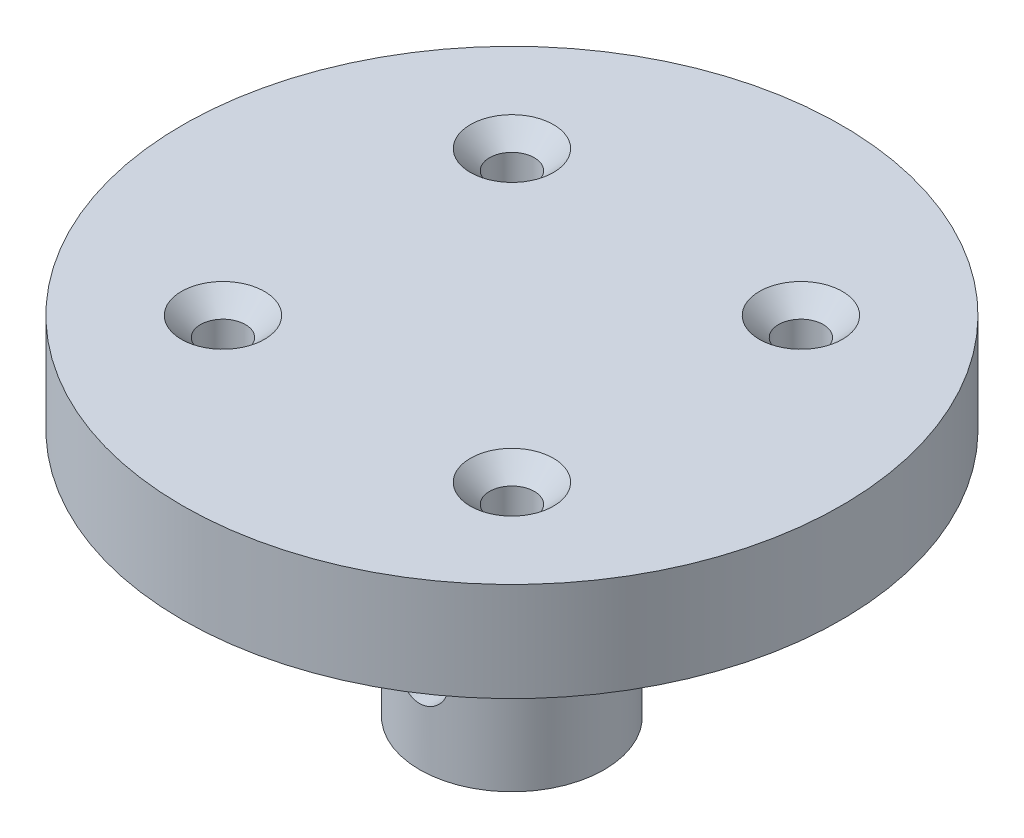
ISO-10303-21;
HEADER;
FILE_DESCRIPTION(('STEP AP214'),'2;1');
FILE_NAME('part.step','',(''),(''),'','','');
FILE_SCHEMA(('AUTOMOTIVE_DESIGN { 1 0 10303 214 1 1 1 1 }'));
ENDSEC;
DATA;
#1=APPLICATION_CONTEXT('core data for automotive mechanical design processes');
#2=APPLICATION_PROTOCOL_DEFINITION('international standard','automotive_design',2000,#1);
#3=PRODUCT_CONTEXT('',#1,'mechanical');
#4=PRODUCT('Part','Part','',(#3));
#5=PRODUCT_RELATED_PRODUCT_CATEGORY('part','',(#4));
#6=PRODUCT_DEFINITION_FORMATION('','',#4);
#7=PRODUCT_DEFINITION_CONTEXT('part definition',#1,'design');
#8=PRODUCT_DEFINITION('design','',#6,#7);
#9=PRODUCT_DEFINITION_SHAPE('','',#8);
#10=(LENGTH_UNIT() NAMED_UNIT(*) SI_UNIT(.MILLI.,.METRE.));
#11=(NAMED_UNIT(*) PLANE_ANGLE_UNIT() SI_UNIT($,.RADIAN.));
#12=(NAMED_UNIT(*) SI_UNIT($,.STERADIAN.) SOLID_ANGLE_UNIT());
#13=UNCERTAINTY_MEASURE_WITH_UNIT(LENGTH_MEASURE(1.E-05),#10,'distance_accuracy_value','');
#14=(GEOMETRIC_REPRESENTATION_CONTEXT(3) GLOBAL_UNCERTAINTY_ASSIGNED_CONTEXT((#13)) GLOBAL_UNIT_ASSIGNED_CONTEXT((#10,
#11,#12)) REPRESENTATION_CONTEXT('',''));
#15=CARTESIAN_POINT('',(0.,0.,0.));
#16=DIRECTION('',(0.,0.,1.));
#17=DIRECTION('',(1.,0.,0.));
#18=AXIS2_PLACEMENT_3D('',#15,#16,#17);
#19=CARTESIAN_POINT('',(0.,-12.6,10.5));
#20=DIRECTION('',(0.,0.,-1.));
#21=DIRECTION('',(-1.,0.,0.));
#22=AXIS2_PLACEMENT_3D('',#19,#20,#21);
#23=CYLINDRICAL_SURFACE('',#22,1.);
#24=CARTESIAN_POINT('',(0.,-12.6,3.));
#25=DIRECTION('',(0.,0.,-1.));
#26=DIRECTION('',(-1.,0.,0.));
#27=AXIS2_PLACEMENT_3D('',#24,#25,#26);
#28=CIRCLE('',#27,1.);
#29=CARTESIAN_POINT('',(-1.,-12.6,3.));
#30=VERTEX_POINT('',#29);
#31=EDGE_CURVE('E97',#30,#30,#28,.F.);
#32=ORIENTED_EDGE('',*,*,#31,.F.);
#33=EDGE_LOOP('',(#32));
#34=FACE_BOUND('',#33,.T.);
#35=CARTESIAN_POINT('',(0.,-12.6,5.));
#36=DIRECTION('',(0.,0.,1.));
#37=DIRECTION('',(1.,0.,0.));
#38=AXIS2_PLACEMENT_3D('',#35,#36,#37);
#39=CIRCLE('',#38,1.);
#40=CARTESIAN_POINT('',(1.,-12.6,5.));
#41=VERTEX_POINT('',#40);
#42=EDGE_CURVE('E100',#41,#41,#39,.T.);
#43=ORIENTED_EDGE('',*,*,#42,.T.);
#44=EDGE_LOOP('',(#43));
#45=FACE_BOUND('',#44,.T.);
#46=ADVANCED_FACE('F52',(#34,#45),#23,.F.);
#47=CARTESIAN_POINT('',(0.,-18.85,0.));
#48=DIRECTION('',(0.,1.,0.));
#49=DIRECTION('',(0.,0.,1.));
#50=AXIS2_PLACEMENT_3D('',#47,#48,#49);
#51=CYLINDRICAL_SURFACE('',#50,7.);
#52=CARTESIAN_POINT('',(0.,-18.85,0.));
#53=DIRECTION('',(0.,-1.,0.));
#54=DIRECTION('',(0.,0.,-1.));
#55=AXIS2_PLACEMENT_3D('',#52,#53,#54);
#56=CIRCLE('',#55,7.);
#57=CARTESIAN_POINT('',(0.,-18.85,-7.));
#58=VERTEX_POINT('',#57);
#59=EDGE_CURVE('E89',#58,#58,#56,.T.);
#60=ORIENTED_EDGE('',*,*,#59,.F.);
#61=EDGE_LOOP('',(#60));
#62=FACE_BOUND('',#61,.T.);
#63=CARTESIAN_POINT('',(0.,0.,0.));
#64=DIRECTION('',(0.,1.,0.));
#65=DIRECTION('',(0.,0.,1.));
#66=AXIS2_PLACEMENT_3D('',#63,#64,#65);
#67=CIRCLE('',#66,7.);
#68=CARTESIAN_POINT('',(0.,0.,7.));
#69=VERTEX_POINT('',#68);
#70=EDGE_CURVE('E65',#69,#69,#67,.F.);
#71=ORIENTED_EDGE('',*,*,#70,.T.);
#72=EDGE_LOOP('',(#71));
#73=FACE_BOUND('',#72,.T.);
#74=CARTESIAN_POINT('',(0.,-14.5,7.));
#75=CARTESIAN_POINT('',(-0.10467230840533,-14.4999976621881,6.99999849339145));
#76=CARTESIAN_POINT('',(-0.209369392593464,-14.4913213337643,6.99762920626555));
#77=CARTESIAN_POINT('',(-0.41574301210352,-14.4569095142351,6.98840792003667));
#78=CARTESIAN_POINT('',(-0.517418147915488,-14.4311662439345,6.98155387677855));
#79=CARTESIAN_POINT('',(-0.714739469024512,-14.3635225636996,6.96411884296715));
#80=CARTESIAN_POINT('',(-0.810393391731334,-14.3216434031288,6.95354275555568));
#81=CARTESIAN_POINT('',(-0.993320208245915,-14.2229966746631,6.92977879411939));
#82=CARTESIAN_POINT('',(-1.08059246340729,-14.1662279734779,6.91659072130679));
#83=CARTESIAN_POINT('',(-1.24636861727917,-14.0379785929943,6.888671162978));
#84=CARTESIAN_POINT('',(-1.32464320870062,-13.9662074105641,6.87391255552202));
#85=CARTESIAN_POINT('',(-1.46820591709325,-13.8106111242001,6.84468772896212));
#86=CARTESIAN_POINT('',(-1.53349229761863,-13.7267844110917,6.83022154918598));
#87=CARTESIAN_POINT('',(-1.65035531555389,-13.5476113661517,6.80294081054074));
#88=CARTESIAN_POINT('',(-1.70166597662043,-13.4520858760411,6.79016040395568));
#89=CARTESIAN_POINT('',(-1.78740705118745,-13.2533607051563,6.76809794364881));
#90=CARTESIAN_POINT('',(-1.82184070230421,-13.1501625006623,6.75881521902513));
#91=CARTESIAN_POINT('',(-1.87204976364692,-12.9415659729038,6.74507952606648));
#92=CARTESIAN_POINT('',(-1.88824191142729,-12.8362752232061,6.7405188849067));
#93=CARTESIAN_POINT('',(-1.90280788480116,-12.6243805733408,6.73642221612276));
#94=CARTESIAN_POINT('',(-1.90118517010821,-12.5177769321585,6.73688521288895));
#95=CARTESIAN_POINT('',(-1.8804978448076,-12.309553294159,6.74268726447652));
#96=CARTESIAN_POINT('',(-1.8619398480795,-12.2078783867305,6.747884682428));
#97=CARTESIAN_POINT('',(-1.80872112583705,-12.0091424603849,6.7623428521674));
#98=CARTESIAN_POINT('',(-1.77405907208639,-11.9120818227733,6.77160393911658));
#99=CARTESIAN_POINT('',(-1.68920885824275,-11.7240202548969,6.79326890429759));
#100=CARTESIAN_POINT('',(-1.63884492773562,-11.6331028650462,6.80570805870577));
#101=CARTESIAN_POINT('',(-1.52414315444328,-11.4608329398641,6.83230889359237));
#102=CARTESIAN_POINT('',(-1.45980247187618,-11.3794823534909,6.84647092386525));
#103=CARTESIAN_POINT('',(-1.31639332124811,-11.2257635157908,6.87550932889115));
#104=CARTESIAN_POINT('',(-1.23690007624952,-11.1537924801063,6.89039365787065));
#105=CARTESIAN_POINT('',(-1.06678981789032,-11.0241200175787,6.91877043240589));
#106=CARTESIAN_POINT('',(-0.976172334533859,-10.9664191939587,6.93226281910812));
#107=CARTESIAN_POINT('',(-0.785756321107684,-10.8667413939808,6.95642349370651));
#108=CARTESIAN_POINT('',(-0.685917204361176,-10.8248384968697,6.96707840937012));
#109=CARTESIAN_POINT('',(-0.480255782655553,-10.7585276307023,6.98426706602557));
#110=CARTESIAN_POINT('',(-0.374434839702728,-10.7341156962889,6.99080174107231));
#111=CARTESIAN_POINT('',(-0.163201737366029,-10.7041084920662,6.99887148822275));
#112=CARTESIAN_POINT('',(-0.0578716219567339,-10.6979734217999,7.00054994263419));
#113=CARTESIAN_POINT('',(0.152313266808665,-10.7032003415541,6.99913151004208));
#114=CARTESIAN_POINT('',(0.257168089992152,-10.7145604528242,6.99603513579174));
#115=CARTESIAN_POINT('',(0.461484240830328,-10.7540132498676,6.9855077638734));
#116=CARTESIAN_POINT('',(0.561008504418504,-10.7818028986655,6.9781553179861));
#117=CARTESIAN_POINT('',(0.753971396141426,-10.8529723031103,6.95995172223145));
#118=CARTESIAN_POINT('',(0.84740935164794,-10.8963537784464,6.94910018644811));
#119=CARTESIAN_POINT('',(1.02762969294416,-10.9984634930448,6.92476849472106));
#120=CARTESIAN_POINT('',(1.11424045039063,-11.0574828083354,6.91123986626638));
#121=CARTESIAN_POINT('',(1.27651761919132,-11.18882867483,6.88311680082363));
#122=CARTESIAN_POINT('',(1.35218178253219,-11.2611579524837,6.86852214583779));
#123=CARTESIAN_POINT('',(1.49270701610501,-11.4195927727021,6.8393811428617));
#124=CARTESIAN_POINT('',(1.55718667947038,-11.5060398153556,6.82484873484721));
#125=CARTESIAN_POINT('',(1.67073495718407,-11.6888362713153,6.79794546867443));
#126=CARTESIAN_POINT('',(1.71980419434173,-11.7851852842263,6.78557452317003));
#127=CARTESIAN_POINT('',(1.80077061107422,-11.9845862495584,6.76453813185029));
#128=CARTESIAN_POINT('',(1.83276568601763,-12.0875961081841,6.75585162142496));
#129=CARTESIAN_POINT('',(1.87889685212383,-12.2978112288831,6.74316912813389));
#130=CARTESIAN_POINT('',(1.89303770916346,-12.4050153634856,6.73917189356668));
#131=CARTESIAN_POINT('',(1.90277772824185,-12.6166636543179,6.73642773708766));
#132=CARTESIAN_POINT('',(1.89899100906749,-12.721077709467,6.73750691175914));
#133=CARTESIAN_POINT('',(1.87441355015337,-12.9277184942869,6.74438531736299));
#134=CARTESIAN_POINT('',(1.8536232783033,-13.0299452840657,6.75018441841632));
#135=CARTESIAN_POINT('',(1.79599076550568,-13.2285054742739,6.76574387263794));
#136=CARTESIAN_POINT('',(1.75928307932493,-13.3248807195772,6.77547097484112));
#137=CARTESIAN_POINT('',(1.67096200011683,-13.5101785137036,6.79779019192726));
#138=CARTESIAN_POINT('',(1.61934619282285,-13.5990998524066,6.81038277078413));
#139=CARTESIAN_POINT('',(1.50083161818715,-13.7698861083673,6.83749226961353));
#140=CARTESIAN_POINT('',(1.43351590238808,-13.8514542838797,6.85205605655265));
#141=CARTESIAN_POINT('',(1.28629950106069,-14.0023362452276,6.88121027619842));
#142=CARTESIAN_POINT('',(1.2063957352606,-14.0716470228671,6.89580071456064));
#143=CARTESIAN_POINT('',(1.03411158498889,-14.1975764083664,6.92375536484669));
#144=CARTESIAN_POINT('',(0.941491772711848,-14.2538758560084,6.93708477908937));
#145=CARTESIAN_POINT('',(0.74774248782017,-14.3500171548525,6.96063041642116));
#146=CARTESIAN_POINT('',(0.646618327861719,-14.389869190144,6.97084856494688));
#147=CARTESIAN_POINT('',(0.454943976905607,-14.4470032755083,6.98575622530485));
#148=CARTESIAN_POINT('',(0.365191805020287,-14.466829893074,6.99105803168741));
#149=CARTESIAN_POINT('',(0.183632631156446,-14.4933285794745,6.998180394295));
#150=CARTESIAN_POINT('',(0.0918258493267723,-14.5000020508916,7.0000013217021));
#151=CARTESIAN_POINT('',(0.,-14.5,7.));
#152=B_SPLINE_CURVE_WITH_KNOTS('',3,(#74,#75,#76,#77,#78,#79,#80,#81,#82,#83,#84,#85,#86,#87,
#88,#89,#90,#91,#92,#93,#94,#95,#96,#97,#98,#99,#100,#101,#102,#103,#104,#105,#106,#107,#108,
#109,#110,#111,#112,#113,#114,#115,#116,#117,#118,#119,#120,#121,#122,#123,#124,#125,#126,#127,
#128,#129,#130,#131,#132,#133,#134,#135,#136,#137,#138,#139,#140,#141,#142,#143,#144,#145,#146,
#147,#148,#149,#150,#151),.UNSPECIFIED.,.T.,.F.,(4,2,2,2,2,2,2,2,2,2,2,2,2,2,2,2,2,2,2,2,2,2,2,
2,2,2,2,2,2,2,2,2,2,2,2,2,2,2,4),(0.,0.313680102851765,0.627503281014146,0.940914590027342,
1.25434976069586,1.57453494995285,1.89476291732232,2.22071605071963,2.54660663010892,
2.86489069141561,3.18311294184965,3.49211701459332,3.80114657801331,4.1137678476166,
4.42645269479161,4.74972085083701,5.07300266957252,5.39778209653389,5.72248786978918,
6.03750352127244,6.35248534661217,6.66183112913997,6.97121104121014,7.28681250596215,
7.60247869150843,7.92739222460589,8.25229262469663,8.57530961762136,8.89824036846572,
9.2101905922909,9.52213223241648,9.83148682713313,10.1408915477934,10.4597033881364,
10.7785933626476,11.1046280519129,11.430460559459,11.7056719720601,11.9808540359708),.UNSPECIFIED.);
#153=CARTESIAN_POINT('',(0.,-14.5,7.));
#154=VERTEX_POINT('',#153);
#155=EDGE_CURVE('E14',#154,#154,#152,.T.);
#156=ORIENTED_EDGE('',*,*,#155,.T.);
#157=EDGE_LOOP('',(#156));
#158=FACE_BOUND('',#157,.T.);
#159=ADVANCED_FACE('F176',(#62,#73,#158),#51,.T.);
#160=CARTESIAN_POINT('',(0.,7.5,0.));
#161=DIRECTION('',(0.,-1.,0.));
#162=DIRECTION('',(0.,0.,-1.));
#163=AXIS2_PLACEMENT_3D('',#160,#161,#162);
#164=CYLINDRICAL_SURFACE('',#163,25.);
#165=CARTESIAN_POINT('',(0.,7.5,0.));
#166=DIRECTION('',(0.,1.,0.));
#167=DIRECTION('',(0.,0.,1.));
#168=AXIS2_PLACEMENT_3D('',#165,#166,#167);
#169=CIRCLE('',#168,25.);
#170=CARTESIAN_POINT('',(0.,7.5,25.));
#171=VERTEX_POINT('',#170);
#172=EDGE_CURVE('E155',#171,#171,#169,.T.);
#173=ORIENTED_EDGE('',*,*,#172,.F.);
#174=EDGE_LOOP('',(#173));
#175=FACE_BOUND('',#174,.T.);
#176=CARTESIAN_POINT('',(0.,0.,0.));
#177=DIRECTION('',(0.,1.,0.));
#178=DIRECTION('',(0.,0.,1.));
#179=AXIS2_PLACEMENT_3D('',#176,#177,#178);
#180=CIRCLE('',#179,25.);
#181=CARTESIAN_POINT('',(0.,0.,25.));
#182=VERTEX_POINT('',#181);
#183=EDGE_CURVE('E154',#182,#182,#180,.T.);
#184=ORIENTED_EDGE('',*,*,#183,.T.);
#185=EDGE_LOOP('',(#184));
#186=FACE_BOUND('',#185,.T.);
#187=ADVANCED_FACE('F54',(#175,#186),#164,.T.);
#188=CARTESIAN_POINT('',(0.,0.,0.));
#189=DIRECTION('',(0.,1.,0.));
#190=DIRECTION('',(0.,0.,1.));
#191=AXIS2_PLACEMENT_3D('',#188,#189,#190);
#192=PLANE('',#191);
#193=ORIENTED_EDGE('',*,*,#70,.F.);
#194=EDGE_LOOP('',(#193));
#195=FACE_BOUND('',#194,.T.);
#196=CARTESIAN_POINT('',(-10.9601551083915,0.,-10.9601551083915));
#197=DIRECTION('',(0.,1.,0.));
#198=DIRECTION('',(0.,0.,1.));
#199=AXIS2_PLACEMENT_3D('',#196,#197,#198);
#200=CIRCLE('',#199,1.725);
#201=CARTESIAN_POINT('',(-10.9601551083915,0.,-9.23515510839148));
#202=VERTEX_POINT('',#201);
#203=EDGE_CURVE('E106',#202,#202,#200,.T.);
#204=ORIENTED_EDGE('',*,*,#203,.T.);
#205=EDGE_LOOP('',(#204));
#206=FACE_BOUND('',#205,.T.);
#207=CARTESIAN_POINT('',(10.9601551083915,0.,-10.9601551083915));
#208=DIRECTION('',(0.,1.,0.));
#209=DIRECTION('',(0.,0.,1.));
#210=AXIS2_PLACEMENT_3D('',#207,#208,#209);
#211=CIRCLE('',#210,1.725);
#212=CARTESIAN_POINT('',(10.9601551083915,0.,-9.23515510839148));
#213=VERTEX_POINT('',#212);
#214=EDGE_CURVE('E118',#213,#213,#211,.T.);
#215=ORIENTED_EDGE('',*,*,#214,.T.);
#216=EDGE_LOOP('',(#215));
#217=FACE_BOUND('',#216,.T.);
#218=CARTESIAN_POINT('',(10.9601551083915,0.,10.9601551083915));
#219=DIRECTION('',(0.,1.,0.));
#220=DIRECTION('',(0.,0.,1.));
#221=AXIS2_PLACEMENT_3D('',#218,#219,#220);
#222=CIRCLE('',#221,1.725);
#223=CARTESIAN_POINT('',(10.9601551083915,0.,12.6851551083915));
#224=VERTEX_POINT('',#223);
#225=EDGE_CURVE('E130',#224,#224,#222,.T.);
#226=ORIENTED_EDGE('',*,*,#225,.T.);
#227=EDGE_LOOP('',(#226));
#228=FACE_BOUND('',#227,.T.);
#229=CARTESIAN_POINT('',(-10.9601551083915,0.,10.9601551083915));
#230=DIRECTION('',(0.,1.,0.));
#231=DIRECTION('',(0.,0.,1.));
#232=AXIS2_PLACEMENT_3D('',#229,#230,#231);
#233=CIRCLE('',#232,1.725);
#234=CARTESIAN_POINT('',(-10.9601551083915,0.,12.6851551083915));
#235=VERTEX_POINT('',#234);
#236=EDGE_CURVE('E142',#235,#235,#233,.T.);
#237=ORIENTED_EDGE('',*,*,#236,.T.);
#238=EDGE_LOOP('',(#237));
#239=FACE_BOUND('',#238,.T.);
#240=ORIENTED_EDGE('',*,*,#183,.F.);
#241=EDGE_LOOP('',(#240));
#242=FACE_BOUND('',#241,.T.);
#243=ADVANCED_FACE('F193',(#195,#206,#217,#228,#239,#242),#192,.F.);
#244=CARTESIAN_POINT('',(0.,7.5,0.));
#245=DIRECTION('',(0.,1.,0.));
#246=DIRECTION('',(0.,0.,1.));
#247=AXIS2_PLACEMENT_3D('',#244,#245,#246);
#248=PLANE('',#247);
#249=CARTESIAN_POINT('',(-10.9601551083915,7.5,-10.9601551083915));
#250=DIRECTION('',(0.,1.,0.));
#251=DIRECTION('',(0.,0.,1.));
#252=AXIS2_PLACEMENT_3D('',#249,#250,#251);
#253=CIRCLE('',#252,3.15);
#254=CARTESIAN_POINT('',(-10.9601551083915,7.5,-7.81015510839149));
#255=VERTEX_POINT('',#254);
#256=EDGE_CURVE('E109',#255,#255,#253,.T.);
#257=ORIENTED_EDGE('',*,*,#256,.F.);
#258=EDGE_LOOP('',(#257));
#259=FACE_BOUND('',#258,.T.);
#260=CARTESIAN_POINT('',(10.9601551083915,7.5,-10.9601551083915));
#261=DIRECTION('',(0.,1.,0.));
#262=DIRECTION('',(0.,0.,1.));
#263=AXIS2_PLACEMENT_3D('',#260,#261,#262);
#264=CIRCLE('',#263,3.15);
#265=CARTESIAN_POINT('',(10.9601551083915,7.5,-7.81015510839149));
#266=VERTEX_POINT('',#265);
#267=EDGE_CURVE('E121',#266,#266,#264,.T.);
#268=ORIENTED_EDGE('',*,*,#267,.F.);
#269=EDGE_LOOP('',(#268));
#270=FACE_BOUND('',#269,.T.);
#271=CARTESIAN_POINT('',(10.9601551083915,7.5,10.9601551083915));
#272=DIRECTION('',(0.,1.,0.));
#273=DIRECTION('',(0.,0.,1.));
#274=AXIS2_PLACEMENT_3D('',#271,#272,#273);
#275=CIRCLE('',#274,3.15);
#276=CARTESIAN_POINT('',(10.9601551083915,7.5,14.1101551083915));
#277=VERTEX_POINT('',#276);
#278=EDGE_CURVE('E133',#277,#277,#275,.T.);
#279=ORIENTED_EDGE('',*,*,#278,.F.);
#280=EDGE_LOOP('',(#279));
#281=FACE_BOUND('',#280,.T.);
#282=CARTESIAN_POINT('',(-10.9601551083915,7.5,10.9601551083915));
#283=DIRECTION('',(0.,1.,0.));
#284=DIRECTION('',(0.,0.,1.));
#285=AXIS2_PLACEMENT_3D('',#282,#283,#284);
#286=CIRCLE('',#285,3.15);
#287=CARTESIAN_POINT('',(-10.9601551083915,7.5,14.1101551083915));
#288=VERTEX_POINT('',#287);
#289=EDGE_CURVE('E145',#288,#288,#286,.T.);
#290=ORIENTED_EDGE('',*,*,#289,.F.);
#291=EDGE_LOOP('',(#290));
#292=FACE_BOUND('',#291,.T.);
#293=ORIENTED_EDGE('',*,*,#172,.T.);
#294=EDGE_LOOP('',(#293));
#295=FACE_BOUND('',#294,.T.);
#296=ADVANCED_FACE('F258',(#259,#270,#281,#292,#295),#248,.T.);
#297=CARTESIAN_POINT('',(-10.9601551083915,0.024999999999999,10.9601551083915));
#298=DIRECTION('',(0.,-1.,0.));
#299=DIRECTION('',(0.,0.,-1.));
#300=AXIS2_PLACEMENT_3D('',#297,#298,#299);
#301=CONICAL_SURFACE('',#300,1.7,0.785398163397483);
#302=ORIENTED_EDGE('',*,*,#236,.F.);
#303=EDGE_LOOP('',(#302));
#304=FACE_BOUND('',#303,.T.);
#305=CARTESIAN_POINT('',(-10.9601551083915,0.024999999999999,10.9601551083915));
#306=DIRECTION('',(0.,1.,0.));
#307=DIRECTION('',(0.,0.,1.));
#308=AXIS2_PLACEMENT_3D('',#305,#306,#307);
#309=CIRCLE('',#308,1.7);
#310=CARTESIAN_POINT('',(-10.9601551083915,0.024999999999999,12.6601551083915));
#311=VERTEX_POINT('',#310);
#312=EDGE_CURVE('E151',#311,#311,#309,.T.);
#313=ORIENTED_EDGE('',*,*,#312,.T.);
#314=EDGE_LOOP('',(#313));
#315=FACE_BOUND('',#314,.T.);
#316=ADVANCED_FACE('F254',(#304,#315),#301,.F.);
#317=CARTESIAN_POINT('',(-10.9601551083915,7.5,10.9601551083915));
#318=DIRECTION('',(0.,1.,0.));
#319=DIRECTION('',(0.,0.,1.));
#320=AXIS2_PLACEMENT_3D('',#317,#318,#319);
#321=CYLINDRICAL_SURFACE('',#320,1.7);
#322=ORIENTED_EDGE('',*,*,#312,.F.);
#323=EDGE_LOOP('',(#322));
#324=FACE_BOUND('',#323,.T.);
#325=CARTESIAN_POINT('',(-10.9601551083915,6.05,10.9601551083915));
#326=DIRECTION('',(0.,1.,0.));
#327=DIRECTION('',(0.,0.,1.));
#328=AXIS2_PLACEMENT_3D('',#325,#326,#327);
#329=CIRCLE('',#328,1.7);
#330=CARTESIAN_POINT('',(-10.9601551083915,6.05,12.6601551083915));
#331=VERTEX_POINT('',#330);
#332=EDGE_CURVE('E148',#331,#331,#329,.T.);
#333=ORIENTED_EDGE('',*,*,#332,.T.);
#334=EDGE_LOOP('',(#333));
#335=FACE_BOUND('',#334,.T.);
#336=ADVANCED_FACE('F250',(#324,#335),#321,.F.);
#337=CARTESIAN_POINT('',(-10.9601551083915,7.5,10.9601551083915));
#338=DIRECTION('',(0.,1.,0.));
#339=DIRECTION('',(0.,0.,1.));
#340=AXIS2_PLACEMENT_3D('',#337,#338,#339);
#341=CONICAL_SURFACE('',#340,3.15,0.785398163397448);
#342=ORIENTED_EDGE('',*,*,#332,.F.);
#343=EDGE_LOOP('',(#342));
#344=FACE_BOUND('',#343,.T.);
#345=ORIENTED_EDGE('',*,*,#289,.T.);
#346=EDGE_LOOP('',(#345));
#347=FACE_BOUND('',#346,.T.);
#348=ADVANCED_FACE('F246',(#344,#347),#341,.F.);
#349=CARTESIAN_POINT('',(10.9601551083915,0.024999999999999,10.9601551083915));
#350=DIRECTION('',(0.,-1.,0.));
#351=DIRECTION('',(0.,0.,-1.));
#352=AXIS2_PLACEMENT_3D('',#349,#350,#351);
#353=CONICAL_SURFACE('',#352,1.7,0.785398163397483);
#354=ORIENTED_EDGE('',*,*,#225,.F.);
#355=EDGE_LOOP('',(#354));
#356=FACE_BOUND('',#355,.T.);
#357=CARTESIAN_POINT('',(10.9601551083915,0.024999999999999,10.9601551083915));
#358=DIRECTION('',(0.,1.,0.));
#359=DIRECTION('',(0.,0.,1.));
#360=AXIS2_PLACEMENT_3D('',#357,#358,#359);
#361=CIRCLE('',#360,1.7);
#362=CARTESIAN_POINT('',(10.9601551083915,0.024999999999999,12.6601551083915));
#363=VERTEX_POINT('',#362);
#364=EDGE_CURVE('E139',#363,#363,#361,.T.);
#365=ORIENTED_EDGE('',*,*,#364,.T.);
#366=EDGE_LOOP('',(#365));
#367=FACE_BOUND('',#366,.T.);
#368=ADVANCED_FACE('F242',(#356,#367),#353,.F.);
#369=CARTESIAN_POINT('',(10.9601551083915,7.5,10.9601551083915));
#370=DIRECTION('',(0.,1.,0.));
#371=DIRECTION('',(0.,0.,1.));
#372=AXIS2_PLACEMENT_3D('',#369,#370,#371);
#373=CYLINDRICAL_SURFACE('',#372,1.7);
#374=ORIENTED_EDGE('',*,*,#364,.F.);
#375=EDGE_LOOP('',(#374));
#376=FACE_BOUND('',#375,.T.);
#377=CARTESIAN_POINT('',(10.9601551083915,6.05,10.9601551083915));
#378=DIRECTION('',(0.,1.,0.));
#379=DIRECTION('',(0.,0.,1.));
#380=AXIS2_PLACEMENT_3D('',#377,#378,#379);
#381=CIRCLE('',#380,1.7);
#382=CARTESIAN_POINT('',(10.9601551083915,6.05,12.6601551083915));
#383=VERTEX_POINT('',#382);
#384=EDGE_CURVE('E136',#383,#383,#381,.T.);
#385=ORIENTED_EDGE('',*,*,#384,.T.);
#386=EDGE_LOOP('',(#385));
#387=FACE_BOUND('',#386,.T.);
#388=ADVANCED_FACE('F238',(#376,#387),#373,.F.);
#389=CARTESIAN_POINT('',(10.9601551083915,7.5,10.9601551083915));
#390=DIRECTION('',(0.,1.,0.));
#391=DIRECTION('',(0.,0.,1.));
#392=AXIS2_PLACEMENT_3D('',#389,#390,#391);
#393=CONICAL_SURFACE('',#392,3.15,0.785398163397448);
#394=ORIENTED_EDGE('',*,*,#384,.F.);
#395=EDGE_LOOP('',(#394));
#396=FACE_BOUND('',#395,.T.);
#397=ORIENTED_EDGE('',*,*,#278,.T.);
#398=EDGE_LOOP('',(#397));
#399=FACE_BOUND('',#398,.T.);
#400=ADVANCED_FACE('F234',(#396,#399),#393,.F.);
#401=CARTESIAN_POINT('',(10.9601551083915,0.024999999999999,-10.9601551083915));
#402=DIRECTION('',(0.,-1.,0.));
#403=DIRECTION('',(0.,0.,-1.));
#404=AXIS2_PLACEMENT_3D('',#401,#402,#403);
#405=CONICAL_SURFACE('',#404,1.7,0.785398163397483);
#406=ORIENTED_EDGE('',*,*,#214,.F.);
#407=EDGE_LOOP('',(#406));
#408=FACE_BOUND('',#407,.T.);
#409=CARTESIAN_POINT('',(10.9601551083915,0.024999999999999,-10.9601551083915));
#410=DIRECTION('',(0.,1.,0.));
#411=DIRECTION('',(0.,0.,1.));
#412=AXIS2_PLACEMENT_3D('',#409,#410,#411);
#413=CIRCLE('',#412,1.7);
#414=CARTESIAN_POINT('',(10.9601551083915,0.024999999999999,-9.26015510839149));
#415=VERTEX_POINT('',#414);
#416=EDGE_CURVE('E127',#415,#415,#413,.T.);
#417=ORIENTED_EDGE('',*,*,#416,.T.);
#418=EDGE_LOOP('',(#417));
#419=FACE_BOUND('',#418,.T.);
#420=ADVANCED_FACE('F230',(#408,#419),#405,.F.);
#421=CARTESIAN_POINT('',(10.9601551083915,7.5,-10.9601551083915));
#422=DIRECTION('',(0.,1.,0.));
#423=DIRECTION('',(0.,0.,1.));
#424=AXIS2_PLACEMENT_3D('',#421,#422,#423);
#425=CYLINDRICAL_SURFACE('',#424,1.7);
#426=ORIENTED_EDGE('',*,*,#416,.F.);
#427=EDGE_LOOP('',(#426));
#428=FACE_BOUND('',#427,.T.);
#429=CARTESIAN_POINT('',(10.9601551083915,6.05,-10.9601551083915));
#430=DIRECTION('',(0.,1.,0.));
#431=DIRECTION('',(0.,0.,1.));
#432=AXIS2_PLACEMENT_3D('',#429,#430,#431);
#433=CIRCLE('',#432,1.7);
#434=CARTESIAN_POINT('',(10.9601551083915,6.05,-9.26015510839149));
#435=VERTEX_POINT('',#434);
#436=EDGE_CURVE('E124',#435,#435,#433,.T.);
#437=ORIENTED_EDGE('',*,*,#436,.T.);
#438=EDGE_LOOP('',(#437));
#439=FACE_BOUND('',#438,.T.);
#440=ADVANCED_FACE('F226',(#428,#439),#425,.F.);
#441=CARTESIAN_POINT('',(10.9601551083915,7.5,-10.9601551083915));
#442=DIRECTION('',(0.,1.,0.));
#443=DIRECTION('',(0.,0.,1.));
#444=AXIS2_PLACEMENT_3D('',#441,#442,#443);
#445=CONICAL_SURFACE('',#444,3.15,0.785398163397448);
#446=ORIENTED_EDGE('',*,*,#436,.F.);
#447=EDGE_LOOP('',(#446));
#448=FACE_BOUND('',#447,.T.);
#449=ORIENTED_EDGE('',*,*,#267,.T.);
#450=EDGE_LOOP('',(#449));
#451=FACE_BOUND('',#450,.T.);
#452=ADVANCED_FACE('F222',(#448,#451),#445,.F.);
#453=CARTESIAN_POINT('',(-10.9601551083915,0.024999999999999,-10.9601551083915));
#454=DIRECTION('',(0.,-1.,0.));
#455=DIRECTION('',(0.,0.,-1.));
#456=AXIS2_PLACEMENT_3D('',#453,#454,#455);
#457=CONICAL_SURFACE('',#456,1.7,0.785398163397483);
#458=ORIENTED_EDGE('',*,*,#203,.F.);
#459=EDGE_LOOP('',(#458));
#460=FACE_BOUND('',#459,.T.);
#461=CARTESIAN_POINT('',(-10.9601551083915,0.024999999999999,-10.9601551083915));
#462=DIRECTION('',(0.,1.,0.));
#463=DIRECTION('',(0.,0.,1.));
#464=AXIS2_PLACEMENT_3D('',#461,#462,#463);
#465=CIRCLE('',#464,1.7);
#466=CARTESIAN_POINT('',(-10.9601551083915,0.024999999999999,-9.26015510839149));
#467=VERTEX_POINT('',#466);
#468=EDGE_CURVE('E115',#467,#467,#465,.T.);
#469=ORIENTED_EDGE('',*,*,#468,.T.);
#470=EDGE_LOOP('',(#469));
#471=FACE_BOUND('',#470,.T.);
#472=ADVANCED_FACE('F218',(#460,#471),#457,.F.);
#473=CARTESIAN_POINT('',(-10.9601551083915,7.5,-10.9601551083915));
#474=DIRECTION('',(0.,1.,0.));
#475=DIRECTION('',(0.,0.,1.));
#476=AXIS2_PLACEMENT_3D('',#473,#474,#475);
#477=CYLINDRICAL_SURFACE('',#476,1.7);
#478=ORIENTED_EDGE('',*,*,#468,.F.);
#479=EDGE_LOOP('',(#478));
#480=FACE_BOUND('',#479,.T.);
#481=CARTESIAN_POINT('',(-10.9601551083915,6.05,-10.9601551083915));
#482=DIRECTION('',(0.,1.,0.));
#483=DIRECTION('',(0.,0.,1.));
#484=AXIS2_PLACEMENT_3D('',#481,#482,#483);
#485=CIRCLE('',#484,1.7);
#486=CARTESIAN_POINT('',(-10.9601551083915,6.05,-9.26015510839149));
#487=VERTEX_POINT('',#486);
#488=EDGE_CURVE('E112',#487,#487,#485,.T.);
#489=ORIENTED_EDGE('',*,*,#488,.T.);
#490=EDGE_LOOP('',(#489));
#491=FACE_BOUND('',#490,.T.);
#492=ADVANCED_FACE('F214',(#480,#491),#477,.F.);
#493=CARTESIAN_POINT('',(-10.9601551083915,7.5,-10.9601551083915));
#494=DIRECTION('',(0.,1.,0.));
#495=DIRECTION('',(0.,0.,1.));
#496=AXIS2_PLACEMENT_3D('',#493,#494,#495);
#497=CONICAL_SURFACE('',#496,3.15,0.785398163397448);
#498=ORIENTED_EDGE('',*,*,#488,.F.);
#499=EDGE_LOOP('',(#498));
#500=FACE_BOUND('',#499,.T.);
#501=ORIENTED_EDGE('',*,*,#256,.T.);
#502=EDGE_LOOP('',(#501));
#503=FACE_BOUND('',#502,.T.);
#504=ADVANCED_FACE('F210',(#500,#503),#497,.F.);
#505=CARTESIAN_POINT('',(0.,-18.85,3.));
#506=DIRECTION('',(0.,0.,-1.));
#507=DIRECTION('',(-1.,0.,0.));
#508=AXIS2_PLACEMENT_3D('',#505,#506,#507);
#509=PLANE('',#508);
#510=ORIENTED_EDGE('',*,*,#31,.T.);
#511=EDGE_LOOP('',(#510));
#512=FACE_BOUND('',#511,.T.);
#513=DIRECTION('',(-1.,0.,0.));
#514=VECTOR('',#513,1.);
#515=CARTESIAN_POINT('',(0.,0.,3.));
#516=LINE('',#515,#514);
#517=CARTESIAN_POINT('',(2.64575131106459,0.,3.));
#518=VERTEX_POINT('',#517);
#519=CARTESIAN_POINT('',(-2.64575131106459,0.,3.));
#520=VERTEX_POINT('',#519);
#521=EDGE_CURVE('E72',#518,#520,#516,.T.);
#522=ORIENTED_EDGE('',*,*,#521,.F.);
#523=DIRECTION('',(0.,1.,0.));
#524=VECTOR('',#523,1.);
#525=CARTESIAN_POINT('',(2.64575131106459,-18.85,3.));
#526=LINE('',#525,#524);
#527=CARTESIAN_POINT('',(2.64575131106459,-18.85,3.));
#528=VERTEX_POINT('',#527);
#529=EDGE_CURVE('E88',#528,#518,#526,.T.);
#530=ORIENTED_EDGE('',*,*,#529,.F.);
#531=DIRECTION('',(-1.,0.,0.));
#532=VECTOR('',#531,1.);
#533=CARTESIAN_POINT('',(0.,-18.85,3.));
#534=LINE('',#533,#532);
#535=CARTESIAN_POINT('',(-2.64575131106459,-18.85,3.));
#536=VERTEX_POINT('',#535);
#537=EDGE_CURVE('E86',#528,#536,#534,.T.);
#538=ORIENTED_EDGE('',*,*,#537,.T.);
#539=DIRECTION('',(0.,1.,0.));
#540=VECTOR('',#539,1.);
#541=CARTESIAN_POINT('',(-2.64575131106459,-18.85,3.));
#542=LINE('',#541,#540);
#543=EDGE_CURVE('E80',#536,#520,#542,.T.);
#544=ORIENTED_EDGE('',*,*,#543,.T.);
#545=EDGE_LOOP('',(#522,#530,#538,#544));
#546=FACE_BOUND('',#545,.T.);
#547=ADVANCED_FACE('F84',(#512,#546),#509,.T.);
#548=CARTESIAN_POINT('',(0.,-18.85,0.));
#549=DIRECTION('',(0.,1.,0.));
#550=DIRECTION('',(0.,0.,1.));
#551=AXIS2_PLACEMENT_3D('',#548,#549,#550);
#552=CYLINDRICAL_SURFACE('',#551,4.);
#553=CARTESIAN_POINT('',(0.,0.,0.));
#554=DIRECTION('',(0.,-1.,0.));
#555=DIRECTION('',(0.,0.,-1.));
#556=AXIS2_PLACEMENT_3D('',#553,#554,#555);
#557=CIRCLE('',#556,4.);
#558=EDGE_CURVE('E92',#520,#518,#557,.T.);
#559=ORIENTED_EDGE('',*,*,#558,.F.);
#560=ORIENTED_EDGE('',*,*,#543,.F.);
#561=CARTESIAN_POINT('',(0.,-18.85,0.));
#562=DIRECTION('',(0.,-1.,0.));
#563=DIRECTION('',(0.,0.,-1.));
#564=AXIS2_PLACEMENT_3D('',#561,#562,#563);
#565=CIRCLE('',#564,4.);
#566=EDGE_CURVE('E170',#536,#528,#565,.T.);
#567=ORIENTED_EDGE('',*,*,#566,.T.);
#568=ORIENTED_EDGE('',*,*,#529,.T.);
#569=EDGE_LOOP('',(#559,#560,#567,#568));
#570=FACE_BOUND('',#569,.T.);
#571=ADVANCED_FACE('F93',(#570),#552,.F.);
#572=CARTESIAN_POINT('',(0.,-18.85,0.));
#573=DIRECTION('',(0.,-1.,0.));
#574=DIRECTION('',(0.,0.,-1.));
#575=AXIS2_PLACEMENT_3D('',#572,#573,#574);
#576=PLANE('',#575);
#577=ORIENTED_EDGE('',*,*,#537,.F.);
#578=ORIENTED_EDGE('',*,*,#566,.F.);
#579=EDGE_LOOP('',(#577,#578));
#580=FACE_BOUND('',#579,.T.);
#581=ORIENTED_EDGE('',*,*,#59,.T.);
#582=EDGE_LOOP('',(#581));
#583=FACE_BOUND('',#582,.T.);
#584=ADVANCED_FACE('F174',(#580,#583),#576,.T.);
#585=ORIENTED_EDGE('',*,*,#558,.T.);
#586=ORIENTED_EDGE('',*,*,#521,.T.);
#587=EDGE_LOOP('',(#585,#586));
#588=FACE_BOUND('',#587,.T.);
#589=ADVANCED_FACE('F96',(#588),#192,.F.);
#590=CARTESIAN_POINT('',(0.,-12.6,5.));
#591=DIRECTION('',(0.,0.,1.));
#592=DIRECTION('',(1.,0.,0.));
#593=AXIS2_PLACEMENT_3D('',#590,#591,#592);
#594=CYLINDRICAL_SURFACE('',#593,1.9);
#595=CARTESIAN_POINT('',(0.,-12.6,5.));
#596=DIRECTION('',(0.,0.,1.));
#597=DIRECTION('',(1.,0.,0.));
#598=AXIS2_PLACEMENT_3D('',#595,#596,#597);
#599=CIRCLE('',#598,1.9);
#600=CARTESIAN_POINT('',(1.9,-12.6,5.));
#601=VERTEX_POINT('',#600);
#602=EDGE_CURVE('E162',#601,#601,#599,.T.);
#603=ORIENTED_EDGE('',*,*,#602,.F.);
#604=EDGE_LOOP('',(#603));
#605=FACE_BOUND('',#604,.T.);
#606=ORIENTED_EDGE('',*,*,#155,.F.);
#607=EDGE_LOOP('',(#606));
#608=FACE_BOUND('',#607,.T.);
#609=ADVANCED_FACE('F183',(#605,#608),#594,.F.);
#610=CARTESIAN_POINT('',(0.,0.,5.));
#611=DIRECTION('',(0.,0.,1.));
#612=DIRECTION('',(1.,0.,0.));
#613=AXIS2_PLACEMENT_3D('',#610,#611,#612);
#614=PLANE('',#613);
#615=ORIENTED_EDGE('',*,*,#42,.F.);
#616=EDGE_LOOP('',(#615));
#617=FACE_BOUND('',#616,.T.);
#618=ORIENTED_EDGE('',*,*,#602,.T.);
#619=EDGE_LOOP('',(#618));
#620=FACE_BOUND('',#619,.T.);
#621=ADVANCED_FACE('F185',(#617,#620),#614,.T.);
#622=CLOSED_SHELL('',(#46,#159,#187,#243,#296,#316,#336,#348,#368,#388,#400,#420,#440,#452,#472,
#492,#504,#547,#571,#584,#589,#609,#621));
#623=MANIFOLD_SOLID_BREP('B2',#622);
#624=ADVANCED_BREP_SHAPE_REPRESENTATION('',(#18,#623),#14);
#625=SHAPE_DEFINITION_REPRESENTATION(#9,#624);
ENDSEC;
END-ISO-10303-21;
